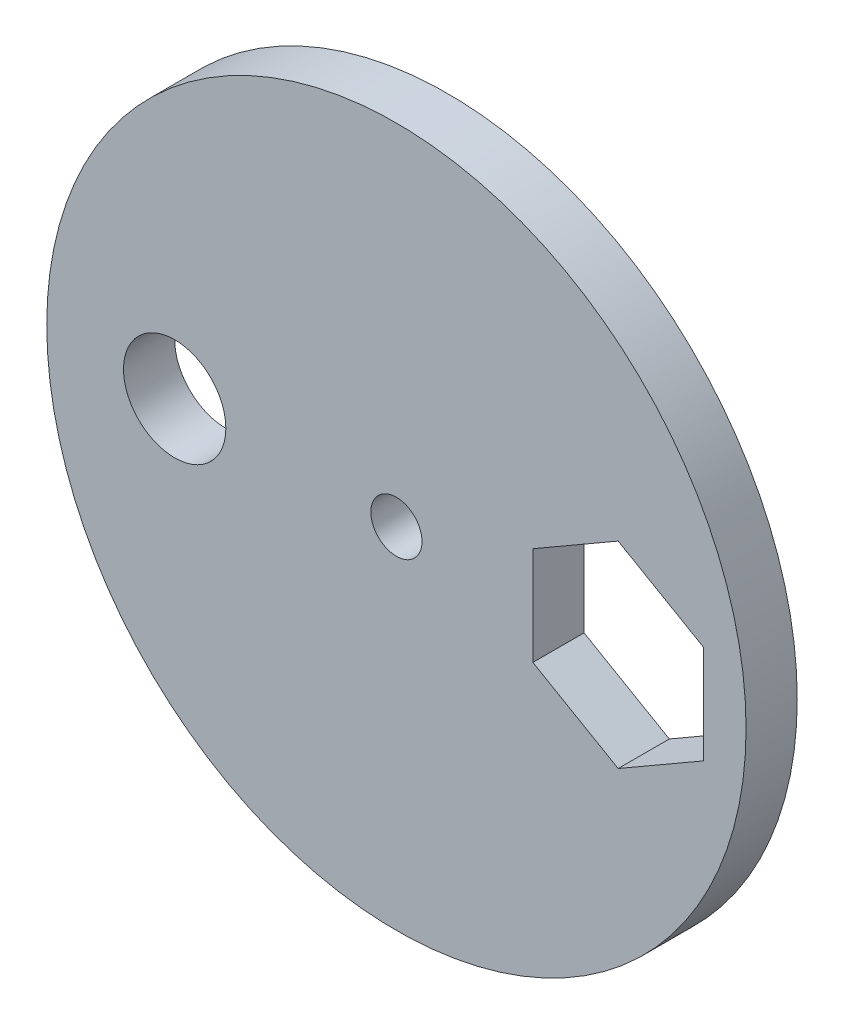
ISO-10303-21;
HEADER;
FILE_DESCRIPTION(('STEP AP214'),'2;1');
FILE_NAME('part.step','',(''),(''),'','','');
FILE_SCHEMA(('AUTOMOTIVE_DESIGN { 1 0 10303 214 1 1 1 1 }'));
ENDSEC;
DATA;
#1=APPLICATION_CONTEXT('core data for automotive mechanical design processes');
#2=APPLICATION_PROTOCOL_DEFINITION('international standard','automotive_design',2000,#1);
#3=PRODUCT_CONTEXT('',#1,'mechanical');
#4=PRODUCT('Part','Part','',(#3));
#5=PRODUCT_RELATED_PRODUCT_CATEGORY('part','',(#4));
#6=PRODUCT_DEFINITION_FORMATION('','',#4);
#7=PRODUCT_DEFINITION_CONTEXT('part definition',#1,'design');
#8=PRODUCT_DEFINITION('design','',#6,#7);
#9=PRODUCT_DEFINITION_SHAPE('','',#8);
#10=(LENGTH_UNIT() NAMED_UNIT(*) SI_UNIT(.MILLI.,.METRE.));
#11=(NAMED_UNIT(*) PLANE_ANGLE_UNIT() SI_UNIT($,.RADIAN.));
#12=(NAMED_UNIT(*) SI_UNIT($,.STERADIAN.) SOLID_ANGLE_UNIT());
#13=UNCERTAINTY_MEASURE_WITH_UNIT(LENGTH_MEASURE(1.E-05),#10,'distance_accuracy_value','');
#14=(GEOMETRIC_REPRESENTATION_CONTEXT(3) GLOBAL_UNCERTAINTY_ASSIGNED_CONTEXT((#13)) GLOBAL_UNIT_ASSIGNED_CONTEXT((#10,
#11,#12)) REPRESENTATION_CONTEXT('',''));
#15=CARTESIAN_POINT('',(0.,0.,0.));
#16=DIRECTION('',(0.,0.,1.));
#17=DIRECTION('',(1.,0.,0.));
#18=AXIS2_PLACEMENT_3D('',#15,#16,#17);
#19=CARTESIAN_POINT('',(0.,0.,3.));
#20=DIRECTION('',(0.,0.,1.));
#21=DIRECTION('',(1.,0.,0.));
#22=AXIS2_PLACEMENT_3D('',#19,#20,#21);
#23=PLANE('',#22);
#24=CARTESIAN_POINT('',(0.,0.,3.));
#25=DIRECTION('',(0.,0.,1.));
#26=DIRECTION('',(1.,0.,0.));
#27=AXIS2_PLACEMENT_3D('',#24,#25,#26);
#28=CIRCLE('',#27,1.5);
#29=CARTESIAN_POINT('',(1.5,0.,3.));
#30=VERTEX_POINT('',#29);
#31=EDGE_CURVE('E138',#30,#30,#28,.T.);
#32=ORIENTED_EDGE('',*,*,#31,.F.);
#33=EDGE_LOOP('',(#32));
#34=FACE_BOUND('',#33,.T.);
#35=CARTESIAN_POINT('',(0.,0.,3.));
#36=DIRECTION('',(0.,0.,1.));
#37=DIRECTION('',(1.,0.,0.));
#38=AXIS2_PLACEMENT_3D('',#35,#36,#37);
#39=CIRCLE('',#38,20.5);
#40=CARTESIAN_POINT('',(20.5,0.,3.));
#41=VERTEX_POINT('',#40);
#42=EDGE_CURVE('E11',#41,#41,#39,.T.);
#43=ORIENTED_EDGE('',*,*,#42,.T.);
#44=EDGE_LOOP('',(#43));
#45=FACE_BOUND('',#44,.T.);
#46=CARTESIAN_POINT('',(-13.,0.,3.));
#47=DIRECTION('',(0.,0.,1.));
#48=DIRECTION('',(1.,0.,0.));
#49=AXIS2_PLACEMENT_3D('',#46,#47,#48);
#50=CIRCLE('',#49,3.);
#51=CARTESIAN_POINT('',(-10.,0.,3.));
#52=VERTEX_POINT('',#51);
#53=EDGE_CURVE('E144',#52,#52,#50,.T.);
#54=ORIENTED_EDGE('',*,*,#53,.F.);
#55=EDGE_LOOP('',(#54));
#56=FACE_BOUND('',#55,.T.);
#57=DIRECTION('',(-0.866025403784439,0.5,0.));
#58=VECTOR('',#57,1.);
#59=CARTESIAN_POINT('',(18.,2.88675134594813,3.));
#60=LINE('',#59,#58);
#61=CARTESIAN_POINT('',(18.,2.88675134594813,3.));
#62=VERTEX_POINT('',#61);
#63=CARTESIAN_POINT('',(13.,5.77350269189626,3.));
#64=VERTEX_POINT('',#63);
#65=EDGE_CURVE('E95',#62,#64,#60,.T.);
#66=ORIENTED_EDGE('',*,*,#65,.F.);
#67=DIRECTION('',(0.,1.,0.));
#68=VECTOR('',#67,1.);
#69=CARTESIAN_POINT('',(18.,-2.88675134594812,3.));
#70=LINE('',#69,#68);
#71=CARTESIAN_POINT('',(18.,-2.88675134594812,3.));
#72=VERTEX_POINT('',#71);
#73=EDGE_CURVE('E87',#72,#62,#70,.T.);
#74=ORIENTED_EDGE('',*,*,#73,.F.);
#75=DIRECTION('',(0.866025403784438,0.5,0.));
#76=VECTOR('',#75,1.);
#77=CARTESIAN_POINT('',(13.,-5.77350269189626,3.));
#78=LINE('',#77,#76);
#79=CARTESIAN_POINT('',(13.,-5.77350269189626,3.));
#80=VERTEX_POINT('',#79);
#81=EDGE_CURVE('E116',#80,#72,#78,.T.);
#82=ORIENTED_EDGE('',*,*,#81,.F.);
#83=DIRECTION('',(0.866025403784439,-0.5,0.));
#84=VECTOR('',#83,1.);
#85=CARTESIAN_POINT('',(8.,-2.88675134594813,3.));
#86=LINE('',#85,#84);
#87=CARTESIAN_POINT('',(8.,-2.88675134594813,3.));
#88=VERTEX_POINT('',#87);
#89=EDGE_CURVE('E114',#88,#80,#86,.T.);
#90=ORIENTED_EDGE('',*,*,#89,.F.);
#91=DIRECTION('',(0.,-1.,0.));
#92=VECTOR('',#91,1.);
#93=CARTESIAN_POINT('',(8.,2.88675134594813,3.));
#94=LINE('',#93,#92);
#95=CARTESIAN_POINT('',(8.,2.88675134594813,3.));
#96=VERTEX_POINT('',#95);
#97=EDGE_CURVE('E110',#96,#88,#94,.T.);
#98=ORIENTED_EDGE('',*,*,#97,.F.);
#99=DIRECTION('',(-0.866025403784439,-0.5,0.));
#100=VECTOR('',#99,1.);
#101=CARTESIAN_POINT('',(13.,5.77350269189626,3.));
#102=LINE('',#101,#100);
#103=EDGE_CURVE('E108',#64,#96,#102,.T.);
#104=ORIENTED_EDGE('',*,*,#103,.F.);
#105=EDGE_LOOP('',(#66,#74,#82,#90,#98,#104));
#106=FACE_BOUND('',#105,.T.);
#107=ADVANCED_FACE('F34',(#34,#45,#56,#106),#23,.T.);
#108=CARTESIAN_POINT('',(0.,0.,0.));
#109=DIRECTION('',(0.,0.,1.));
#110=DIRECTION('',(1.,0.,0.));
#111=AXIS2_PLACEMENT_3D('',#108,#109,#110);
#112=PLANE('',#111);
#113=CARTESIAN_POINT('',(0.,0.,0.));
#114=DIRECTION('',(0.,0.,1.));
#115=DIRECTION('',(1.,0.,0.));
#116=AXIS2_PLACEMENT_3D('',#113,#114,#115);
#117=CIRCLE('',#116,1.5);
#118=CARTESIAN_POINT('',(1.5,0.,0.));
#119=VERTEX_POINT('',#118);
#120=EDGE_CURVE('E103',#119,#119,#117,.T.);
#121=ORIENTED_EDGE('',*,*,#120,.T.);
#122=EDGE_LOOP('',(#121));
#123=FACE_BOUND('',#122,.T.);
#124=CARTESIAN_POINT('',(0.,0.,0.));
#125=DIRECTION('',(0.,0.,1.));
#126=DIRECTION('',(1.,0.,0.));
#127=AXIS2_PLACEMENT_3D('',#124,#125,#126);
#128=CIRCLE('',#127,20.5);
#129=CARTESIAN_POINT('',(20.5,0.,0.));
#130=VERTEX_POINT('',#129);
#131=EDGE_CURVE('E38',#130,#130,#128,.T.);
#132=ORIENTED_EDGE('',*,*,#131,.F.);
#133=EDGE_LOOP('',(#132));
#134=FACE_BOUND('',#133,.T.);
#135=CARTESIAN_POINT('',(-13.,0.,0.));
#136=DIRECTION('',(0.,0.,1.));
#137=DIRECTION('',(1.,0.,0.));
#138=AXIS2_PLACEMENT_3D('',#135,#136,#137);
#139=CIRCLE('',#138,3.);
#140=CARTESIAN_POINT('',(-10.,0.,0.));
#141=VERTEX_POINT('',#140);
#142=EDGE_CURVE('E141',#141,#141,#139,.T.);
#143=ORIENTED_EDGE('',*,*,#142,.T.);
#144=EDGE_LOOP('',(#143));
#145=FACE_BOUND('',#144,.T.);
#146=DIRECTION('',(0.,1.,0.));
#147=VECTOR('',#146,1.);
#148=CARTESIAN_POINT('',(18.,-2.88675134594812,0.));
#149=LINE('',#148,#147);
#150=CARTESIAN_POINT('',(18.,-2.88675134594813,0.));
#151=VERTEX_POINT('',#150);
#152=CARTESIAN_POINT('',(18.,2.88675134594813,0.));
#153=VERTEX_POINT('',#152);
#154=EDGE_CURVE('E57',#151,#153,#149,.T.);
#155=ORIENTED_EDGE('',*,*,#154,.T.);
#156=DIRECTION('',(-0.866025403784439,0.5,0.));
#157=VECTOR('',#156,1.);
#158=CARTESIAN_POINT('',(18.,2.88675134594813,0.));
#159=LINE('',#158,#157);
#160=CARTESIAN_POINT('',(13.,5.77350269189626,0.));
#161=VERTEX_POINT('',#160);
#162=EDGE_CURVE('E102',#153,#161,#159,.T.);
#163=ORIENTED_EDGE('',*,*,#162,.T.);
#164=DIRECTION('',(-0.866025403784439,-0.5,0.));
#165=VECTOR('',#164,1.);
#166=CARTESIAN_POINT('',(13.,5.77350269189626,0.));
#167=LINE('',#166,#165);
#168=CARTESIAN_POINT('',(8.,2.88675134594813,0.));
#169=VERTEX_POINT('',#168);
#170=EDGE_CURVE('E120',#161,#169,#167,.T.);
#171=ORIENTED_EDGE('',*,*,#170,.T.);
#172=DIRECTION('',(0.,-1.,0.));
#173=VECTOR('',#172,1.);
#174=CARTESIAN_POINT('',(8.,2.88675134594813,0.));
#175=LINE('',#174,#173);
#176=CARTESIAN_POINT('',(8.,-2.88675134594813,0.));
#177=VERTEX_POINT('',#176);
#178=EDGE_CURVE('E123',#169,#177,#175,.T.);
#179=ORIENTED_EDGE('',*,*,#178,.T.);
#180=DIRECTION('',(0.866025403784439,-0.5,0.));
#181=VECTOR('',#180,1.);
#182=CARTESIAN_POINT('',(8.,-2.88675134594813,0.));
#183=LINE('',#182,#181);
#184=CARTESIAN_POINT('',(13.,-5.77350269189626,0.));
#185=VERTEX_POINT('',#184);
#186=EDGE_CURVE('E126',#177,#185,#183,.T.);
#187=ORIENTED_EDGE('',*,*,#186,.T.);
#188=DIRECTION('',(0.866025403784438,0.5,0.));
#189=VECTOR('',#188,1.);
#190=CARTESIAN_POINT('',(13.,-5.77350269189626,0.));
#191=LINE('',#190,#189);
#192=EDGE_CURVE('E96',#185,#151,#191,.T.);
#193=ORIENTED_EDGE('',*,*,#192,.T.);
#194=EDGE_LOOP('',(#155,#163,#171,#179,#187,#193));
#195=FACE_BOUND('',#194,.T.);
#196=ADVANCED_FACE('F150',(#123,#134,#145,#195),#112,.F.);
#197=CARTESIAN_POINT('',(0.,0.,3.));
#198=DIRECTION('',(0.,0.,-1.));
#199=DIRECTION('',(-1.,0.,0.));
#200=AXIS2_PLACEMENT_3D('',#197,#198,#199);
#201=CYLINDRICAL_SURFACE('',#200,20.5);
#202=ORIENTED_EDGE('',*,*,#42,.F.);
#203=EDGE_LOOP('',(#202));
#204=FACE_BOUND('',#203,.T.);
#205=ORIENTED_EDGE('',*,*,#131,.T.);
#206=EDGE_LOOP('',(#205));
#207=FACE_BOUND('',#206,.T.);
#208=ADVANCED_FACE('F36',(#204,#207),#201,.T.);
#209=CARTESIAN_POINT('',(-13.,0.,3.));
#210=DIRECTION('',(0.,0.,-1.));
#211=DIRECTION('',(-1.,0.,0.));
#212=AXIS2_PLACEMENT_3D('',#209,#210,#211);
#213=CYLINDRICAL_SURFACE('',#212,3.);
#214=ORIENTED_EDGE('',*,*,#53,.T.);
#215=EDGE_LOOP('',(#214));
#216=FACE_BOUND('',#215,.T.);
#217=ORIENTED_EDGE('',*,*,#142,.F.);
#218=EDGE_LOOP('',(#217));
#219=FACE_BOUND('',#218,.T.);
#220=ADVANCED_FACE('F153',(#216,#219),#213,.F.);
#221=CARTESIAN_POINT('',(0.,0.,3.));
#222=DIRECTION('',(0.,0.,-1.));
#223=DIRECTION('',(-1.,0.,0.));
#224=AXIS2_PLACEMENT_3D('',#221,#222,#223);
#225=CYLINDRICAL_SURFACE('',#224,1.5);
#226=ORIENTED_EDGE('',*,*,#31,.T.);
#227=EDGE_LOOP('',(#226));
#228=FACE_BOUND('',#227,.T.);
#229=ORIENTED_EDGE('',*,*,#120,.F.);
#230=EDGE_LOOP('',(#229));
#231=FACE_BOUND('',#230,.T.);
#232=ADVANCED_FACE('F155',(#228,#231),#225,.F.);
#233=CARTESIAN_POINT('',(18.,-2.88675134594812,3.));
#234=DIRECTION('',(-1.,0.,0.));
#235=DIRECTION('',(0.,0.,1.));
#236=AXIS2_PLACEMENT_3D('',#233,#234,#235);
#237=PLANE('',#236);
#238=ORIENTED_EDGE('',*,*,#154,.F.);
#239=DIRECTION('',(0.,0.,-1.));
#240=VECTOR('',#239,1.);
#241=CARTESIAN_POINT('',(18.,-2.88675134594812,3.));
#242=LINE('',#241,#240);
#243=EDGE_CURVE('E91',#72,#151,#242,.T.);
#244=ORIENTED_EDGE('',*,*,#243,.F.);
#245=ORIENTED_EDGE('',*,*,#73,.T.);
#246=DIRECTION('',(0.,0.,-1.));
#247=VECTOR('',#246,1.);
#248=CARTESIAN_POINT('',(18.,2.88675134594813,3.));
#249=LINE('',#248,#247);
#250=EDGE_CURVE('E90',#62,#153,#249,.T.);
#251=ORIENTED_EDGE('',*,*,#250,.T.);
#252=EDGE_LOOP('',(#238,#244,#245,#251));
#253=FACE_BOUND('',#252,.T.);
#254=ADVANCED_FACE('F89',(#253),#237,.T.);
#255=CARTESIAN_POINT('',(18.,2.88675134594813,3.));
#256=DIRECTION('',(-0.5,-0.866025403784439,0.));
#257=DIRECTION('',(0.866025403784439,-0.5,0.));
#258=AXIS2_PLACEMENT_3D('',#255,#256,#257);
#259=PLANE('',#258);
#260=ORIENTED_EDGE('',*,*,#162,.F.);
#261=ORIENTED_EDGE('',*,*,#250,.F.);
#262=ORIENTED_EDGE('',*,*,#65,.T.);
#263=DIRECTION('',(0.,0.,-1.));
#264=VECTOR('',#263,1.);
#265=CARTESIAN_POINT('',(13.,5.77350269189626,3.));
#266=LINE('',#265,#264);
#267=EDGE_CURVE('E104',#64,#161,#266,.T.);
#268=ORIENTED_EDGE('',*,*,#267,.T.);
#269=EDGE_LOOP('',(#260,#261,#262,#268));
#270=FACE_BOUND('',#269,.T.);
#271=ADVANCED_FACE('F99',(#270),#259,.T.);
#272=CARTESIAN_POINT('',(13.,5.77350269189626,3.));
#273=DIRECTION('',(0.5,-0.866025403784439,0.));
#274=DIRECTION('',(0.866025403784439,0.5,0.));
#275=AXIS2_PLACEMENT_3D('',#272,#273,#274);
#276=PLANE('',#275);
#277=ORIENTED_EDGE('',*,*,#170,.F.);
#278=ORIENTED_EDGE('',*,*,#267,.F.);
#279=ORIENTED_EDGE('',*,*,#103,.T.);
#280=DIRECTION('',(0.,0.,-1.));
#281=VECTOR('',#280,1.);
#282=CARTESIAN_POINT('',(8.,2.88675134594813,3.));
#283=LINE('',#282,#281);
#284=EDGE_CURVE('E135',#96,#169,#283,.T.);
#285=ORIENTED_EDGE('',*,*,#284,.T.);
#286=EDGE_LOOP('',(#277,#278,#279,#285));
#287=FACE_BOUND('',#286,.T.);
#288=ADVANCED_FACE('F216',(#287),#276,.T.);
#289=CARTESIAN_POINT('',(8.,2.88675134594813,3.));
#290=DIRECTION('',(1.,0.,0.));
#291=DIRECTION('',(0.,0.,-1.));
#292=AXIS2_PLACEMENT_3D('',#289,#290,#291);
#293=PLANE('',#292);
#294=ORIENTED_EDGE('',*,*,#178,.F.);
#295=ORIENTED_EDGE('',*,*,#284,.F.);
#296=ORIENTED_EDGE('',*,*,#97,.T.);
#297=DIRECTION('',(0.,0.,-1.));
#298=VECTOR('',#297,1.);
#299=CARTESIAN_POINT('',(8.,-2.88675134594813,3.));
#300=LINE('',#299,#298);
#301=EDGE_CURVE('E133',#88,#177,#300,.T.);
#302=ORIENTED_EDGE('',*,*,#301,.T.);
#303=EDGE_LOOP('',(#294,#295,#296,#302));
#304=FACE_BOUND('',#303,.T.);
#305=ADVANCED_FACE('F225',(#304),#293,.T.);
#306=CARTESIAN_POINT('',(8.,-2.88675134594813,3.));
#307=DIRECTION('',(0.5,0.866025403784438,0.));
#308=DIRECTION('',(-0.866025403784439,0.5,0.));
#309=AXIS2_PLACEMENT_3D('',#306,#307,#308);
#310=PLANE('',#309);
#311=ORIENTED_EDGE('',*,*,#186,.F.);
#312=ORIENTED_EDGE('',*,*,#301,.F.);
#313=ORIENTED_EDGE('',*,*,#89,.T.);
#314=DIRECTION('',(0.,0.,-1.));
#315=VECTOR('',#314,1.);
#316=CARTESIAN_POINT('',(13.,-5.77350269189626,3.));
#317=LINE('',#316,#315);
#318=EDGE_CURVE('E49',#80,#185,#317,.T.);
#319=ORIENTED_EDGE('',*,*,#318,.T.);
#320=EDGE_LOOP('',(#311,#312,#313,#319));
#321=FACE_BOUND('',#320,.T.);
#322=ADVANCED_FACE('F235',(#321),#310,.T.);
#323=CARTESIAN_POINT('',(13.,-5.77350269189626,3.));
#324=DIRECTION('',(-0.5,0.866025403784438,0.));
#325=DIRECTION('',(-0.866025403784439,-0.5,0.));
#326=AXIS2_PLACEMENT_3D('',#323,#324,#325);
#327=PLANE('',#326);
#328=ORIENTED_EDGE('',*,*,#192,.F.);
#329=ORIENTED_EDGE('',*,*,#318,.F.);
#330=ORIENTED_EDGE('',*,*,#81,.T.);
#331=ORIENTED_EDGE('',*,*,#243,.T.);
#332=EDGE_LOOP('',(#328,#329,#330,#331));
#333=FACE_BOUND('',#332,.T.);
#334=ADVANCED_FACE('F245',(#333),#327,.T.);
#335=CLOSED_SHELL('',(#107,#196,#208,#220,#232,#254,#271,#288,#305,#322,#334));
#336=MANIFOLD_SOLID_BREP('B2',#335);
#337=ADVANCED_BREP_SHAPE_REPRESENTATION('',(#18,#336),#14);
#338=SHAPE_DEFINITION_REPRESENTATION(#9,#337);
ENDSEC;
END-ISO-10303-21;
